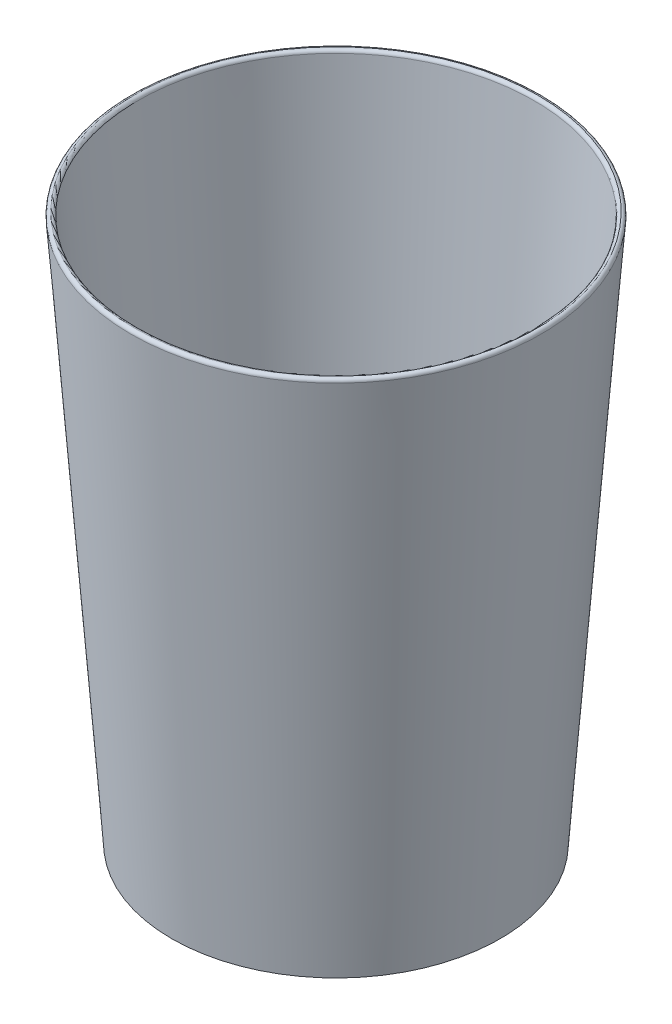
ISO-10303-21;
HEADER;
FILE_DESCRIPTION(('STEP AP214'),'2;1');
FILE_NAME('part.step','',(''),(''),'','','');
FILE_SCHEMA(('AUTOMOTIVE_DESIGN { 1 0 10303 214 1 1 1 1 }'));
ENDSEC;
DATA;
#1=APPLICATION_CONTEXT('core data for automotive mechanical design processes');
#2=APPLICATION_PROTOCOL_DEFINITION('international standard','automotive_design',2000,#1);
#3=PRODUCT_CONTEXT('',#1,'mechanical');
#4=PRODUCT('Part','Part','',(#3));
#5=PRODUCT_RELATED_PRODUCT_CATEGORY('part','',(#4));
#6=PRODUCT_DEFINITION_FORMATION('','',#4);
#7=PRODUCT_DEFINITION_CONTEXT('part definition',#1,'design');
#8=PRODUCT_DEFINITION('design','',#6,#7);
#9=PRODUCT_DEFINITION_SHAPE('','',#8);
#10=(LENGTH_UNIT() NAMED_UNIT(*) SI_UNIT(.MILLI.,.METRE.));
#11=(NAMED_UNIT(*) PLANE_ANGLE_UNIT() SI_UNIT($,.RADIAN.));
#12=(NAMED_UNIT(*) SI_UNIT($,.STERADIAN.) SOLID_ANGLE_UNIT());
#13=UNCERTAINTY_MEASURE_WITH_UNIT(LENGTH_MEASURE(1.E-05),#10,'distance_accuracy_value','');
#14=(GEOMETRIC_REPRESENTATION_CONTEXT(3) GLOBAL_UNCERTAINTY_ASSIGNED_CONTEXT((#13)) GLOBAL_UNIT_ASSIGNED_CONTEXT((#10,
#11,#12)) REPRESENTATION_CONTEXT('',''));
#15=CARTESIAN_POINT('',(0.,0.,0.));
#16=DIRECTION('',(0.,0.,1.));
#17=DIRECTION('',(1.,0.,0.));
#18=AXIS2_PLACEMENT_3D('',#15,#16,#17);
#19=CARTESIAN_POINT('',(0.,0.,0.));
#20=DIRECTION('',(0.,1.,0.));
#21=DIRECTION('',(0.,0.,1.));
#22=AXIS2_PLACEMENT_3D('',#19,#20,#21);
#23=CONICAL_SURFACE('',#22,120.,0.0748598477107669);
#24=CARTESIAN_POINT('',(0.,397.313025129396,0.));
#25=DIRECTION('',(0.,-1.,0.));
#26=DIRECTION('',(0.,0.,-1.));
#27=AXIS2_PLACEMENT_3D('',#24,#25,#26);
#28=CIRCLE('',#27,149.798476884705);
#29=CARTESIAN_POINT('',(0.,397.313025129396,-149.798476884705));
#30=VERTEX_POINT('',#29);
#31=EDGE_CURVE('E10',#30,#30,#28,.T.);
#32=ORIENTED_EDGE('',*,*,#31,.T.);
#33=EDGE_LOOP('',(#32));
#34=FACE_BOUND('',#33,.T.);
#35=CARTESIAN_POINT('',(0.,0.,0.));
#36=DIRECTION('',(0.,-1.,0.));
#37=DIRECTION('',(0.,0.,-1.));
#38=AXIS2_PLACEMENT_3D('',#35,#36,#37);
#39=CIRCLE('',#38,120.);
#40=CARTESIAN_POINT('',(0.,0.,-120.));
#41=VERTEX_POINT('',#40);
#42=EDGE_CURVE('E42',#41,#41,#39,.T.);
#43=ORIENTED_EDGE('',*,*,#42,.F.);
#44=EDGE_LOOP('',(#43));
#45=FACE_BOUND('',#44,.T.);
#46=ADVANCED_FACE('F30',(#34,#45),#23,.T.);
#47=CARTESIAN_POINT('',(120.,0.,0.));
#48=DIRECTION('',(0.,-1.,0.));
#49=DIRECTION('',(0.,0.,-1.));
#50=AXIS2_PLACEMENT_3D('',#47,#48,#49);
#51=PLANE('',#50);
#52=ORIENTED_EDGE('',*,*,#42,.T.);
#53=EDGE_LOOP('',(#52));
#54=FACE_BOUND('',#53,.T.);
#55=ADVANCED_FACE('F68',(#54),#51,.T.);
#56=CARTESIAN_POINT('',(0.,0.373949741208169,0.));
#57=DIRECTION('',(0.,1.,0.));
#58=DIRECTION('',(0.,0.,1.));
#59=AXIS2_PLACEMENT_3D('',#56,#57,#58);
#60=CONICAL_SURFACE('',#59,115.014003450558,0.0748598477107669);
#61=CARTESIAN_POINT('',(0.,397.686974870604,0.));
#62=DIRECTION('',(0.,1.,0.));
#63=DIRECTION('',(0.,0.,1.));
#64=AXIS2_PLACEMENT_3D('',#61,#62,#63);
#65=CIRCLE('',#64,144.812480335262);
#66=CARTESIAN_POINT('',(0.,397.686974870604,144.812480335262));
#67=VERTEX_POINT('',#66);
#68=EDGE_CURVE('E38',#67,#67,#65,.T.);
#69=ORIENTED_EDGE('',*,*,#68,.T.);
#70=EDGE_LOOP('',(#69));
#71=FACE_BOUND('',#70,.T.);
#72=CARTESIAN_POINT('',(0.,5.,0.));
#73=DIRECTION('',(0.,-1.,0.));
#74=DIRECTION('',(0.,0.,-1.));
#75=AXIS2_PLACEMENT_3D('',#72,#73,#74);
#76=CIRCLE('',#75,115.360957219967);
#77=CARTESIAN_POINT('',(0.,5.,-115.360957219967));
#78=VERTEX_POINT('',#77);
#79=EDGE_CURVE('E47',#78,#78,#76,.T.);
#80=ORIENTED_EDGE('',*,*,#79,.T.);
#81=EDGE_LOOP('',(#80));
#82=FACE_BOUND('',#81,.T.);
#83=ADVANCED_FACE('F64',(#71,#82),#60,.F.);
#84=CARTESIAN_POINT('',(120.,5.,0.));
#85=DIRECTION('',(0.,-1.,0.));
#86=DIRECTION('',(0.,0.,-1.));
#87=AXIS2_PLACEMENT_3D('',#84,#85,#86);
#88=PLANE('',#87);
#89=ORIENTED_EDGE('',*,*,#79,.F.);
#90=EDGE_LOOP('',(#89));
#91=FACE_BOUND('',#90,.T.);
#92=ADVANCED_FACE('F57',(#91),#88,.F.);
#93=CARTESIAN_POINT('',(0.,397.5,0.));
#94=DIRECTION('',(0.,1.,0.));
#95=DIRECTION('',(0.,0.,1.));
#96=AXIS2_PLACEMENT_3D('',#93,#94,#95);
#97=TOROIDAL_SURFACE('',#96,147.305478609984,2.5);
#98=ORIENTED_EDGE('',*,*,#31,.F.);
#99=EDGE_LOOP('',(#98));
#100=FACE_BOUND('',#99,.T.);
#101=CARTESIAN_POINT('',(0.,400.,0.));
#102=DIRECTION('',(0.,1.,0.));
#103=DIRECTION('',(0.,0.,1.));
#104=AXIS2_PLACEMENT_3D('',#101,#102,#103);
#105=CIRCLE('',#104,147.305478609984);
#106=CARTESIAN_POINT('',(0.,400.,147.305478609984));
#107=VERTEX_POINT('',#106);
#108=EDGE_CURVE('E34',#107,#107,#105,.T.);
#109=ORIENTED_EDGE('',*,*,#108,.F.);
#110=EDGE_LOOP('',(#109));
#111=FACE_BOUND('',#110,.T.);
#112=ADVANCED_FACE('F32',(#100,#111),#97,.T.);
#113=CARTESIAN_POINT('',(0.,397.5,0.));
#114=DIRECTION('',(0.,1.,0.));
#115=DIRECTION('',(0.,0.,1.));
#116=AXIS2_PLACEMENT_3D('',#113,#114,#115);
#117=TOROIDAL_SURFACE('',#116,147.305478609984,2.5);
#118=ORIENTED_EDGE('',*,*,#68,.F.);
#119=EDGE_LOOP('',(#118));
#120=FACE_BOUND('',#119,.T.);
#121=ORIENTED_EDGE('',*,*,#108,.T.);
#122=EDGE_LOOP('',(#121));
#123=FACE_BOUND('',#122,.T.);
#124=ADVANCED_FACE('F54',(#120,#123),#117,.T.);
#125=CLOSED_SHELL('',(#46,#55,#83,#92,#112,#124));
#126=MANIFOLD_SOLID_BREP('B2',#125);
#127=ADVANCED_BREP_SHAPE_REPRESENTATION('',(#18,#126),#14);
#128=SHAPE_DEFINITION_REPRESENTATION(#9,#127);
ENDSEC;
END-ISO-10303-21;
